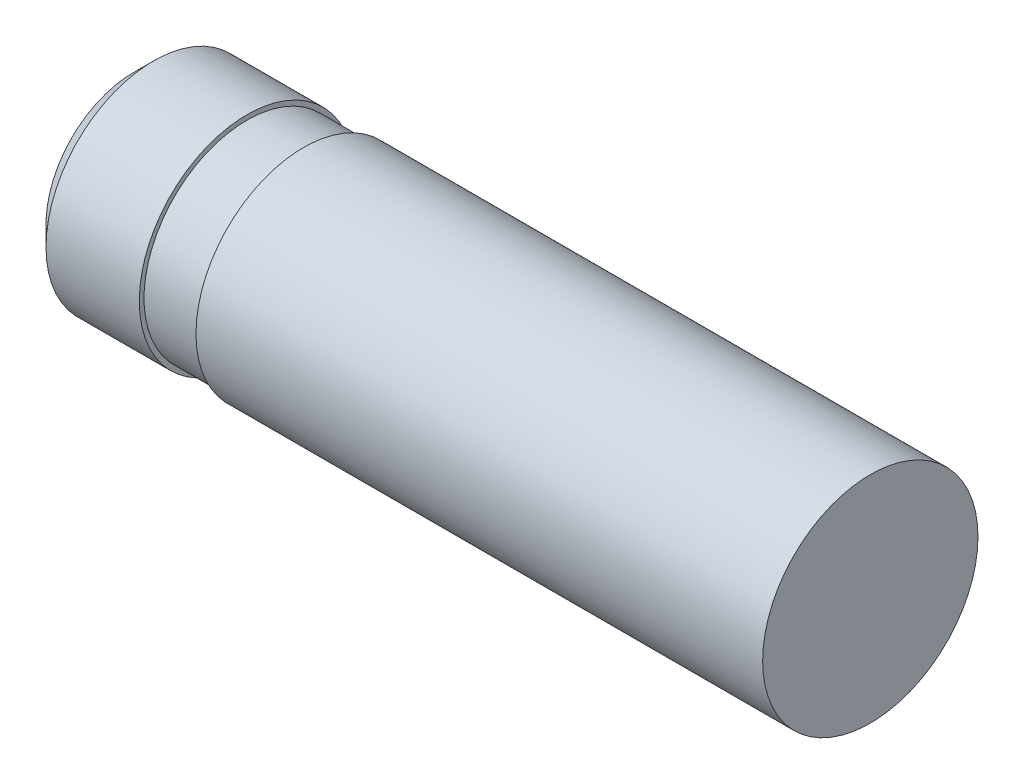
ISO-10303-21;
HEADER;
FILE_DESCRIPTION(('STEP AP214'),'2;1');
FILE_NAME('part.step','',(''),(''),'','','');
FILE_SCHEMA(('AUTOMOTIVE_DESIGN { 1 0 10303 214 1 1 1 1 }'));
ENDSEC;
DATA;
#1=APPLICATION_CONTEXT('core data for automotive mechanical design processes');
#2=APPLICATION_PROTOCOL_DEFINITION('international standard','automotive_design',2000,#1);
#3=PRODUCT_CONTEXT('',#1,'mechanical');
#4=PRODUCT('Part','Part','',(#3));
#5=PRODUCT_RELATED_PRODUCT_CATEGORY('part','',(#4));
#6=PRODUCT_DEFINITION_FORMATION('','',#4);
#7=PRODUCT_DEFINITION_CONTEXT('part definition',#1,'design');
#8=PRODUCT_DEFINITION('design','',#6,#7);
#9=PRODUCT_DEFINITION_SHAPE('','',#8);
#10=(LENGTH_UNIT() NAMED_UNIT(*) SI_UNIT(.MILLI.,.METRE.));
#11=(NAMED_UNIT(*) PLANE_ANGLE_UNIT() SI_UNIT($,.RADIAN.));
#12=(NAMED_UNIT(*) SI_UNIT($,.STERADIAN.) SOLID_ANGLE_UNIT());
#13=UNCERTAINTY_MEASURE_WITH_UNIT(LENGTH_MEASURE(1.E-05),#10,'distance_accuracy_value','');
#14=(GEOMETRIC_REPRESENTATION_CONTEXT(3) GLOBAL_UNCERTAINTY_ASSIGNED_CONTEXT((#13)) GLOBAL_UNIT_ASSIGNED_CONTEXT((#10,
#11,#12)) REPRESENTATION_CONTEXT('',''));
#15=CARTESIAN_POINT('',(0.,0.,0.));
#16=DIRECTION('',(0.,0.,1.));
#17=DIRECTION('',(1.,0.,0.));
#18=AXIS2_PLACEMENT_3D('',#15,#16,#17);
#19=CARTESIAN_POINT('',(0.,0.,0.));
#20=DIRECTION('',(-1.,0.,0.));
#21=DIRECTION('',(0.,0.,1.));
#22=AXIS2_PLACEMENT_3D('',#19,#20,#21);
#23=PLANE('',#22);
#24=CARTESIAN_POINT('',(0.,0.,0.));
#25=DIRECTION('',(1.,0.,0.));
#26=DIRECTION('',(0.,0.,-1.));
#27=AXIS2_PLACEMENT_3D('',#24,#25,#26);
#28=CIRCLE('',#27,1.54644660940673);
#29=CARTESIAN_POINT('',(0.,0.,-1.54644660940673));
#30=VERTEX_POINT('',#29);
#31=EDGE_CURVE('E10',#30,#30,#28,.T.);
#32=ORIENTED_EDGE('',*,*,#31,.F.);
#33=EDGE_LOOP('',(#32));
#34=FACE_BOUND('',#33,.T.);
#35=ADVANCED_FACE('F41',(#34),#23,.T.);
#36=CARTESIAN_POINT('',(0.353553390593273,0.,0.));
#37=DIRECTION('',(1.,0.,0.));
#38=DIRECTION('',(0.,0.,-1.));
#39=AXIS2_PLACEMENT_3D('',#36,#37,#38);
#40=CONICAL_SURFACE('',#39,1.9,0.785398163397451);
#41=ORIENTED_EDGE('',*,*,#31,.T.);
#42=EDGE_LOOP('',(#41));
#43=FACE_BOUND('',#42,.T.);
#44=CARTESIAN_POINT('',(0.353553390593273,0.,0.));
#45=DIRECTION('',(1.,0.,0.));
#46=DIRECTION('',(0.,0.,-1.));
#47=AXIS2_PLACEMENT_3D('',#44,#45,#46);
#48=CIRCLE('',#47,1.9);
#49=CARTESIAN_POINT('',(0.353553390593273,0.,-1.9));
#50=VERTEX_POINT('',#49);
#51=EDGE_CURVE('E48',#50,#50,#48,.T.);
#52=ORIENTED_EDGE('',*,*,#51,.F.);
#53=EDGE_LOOP('',(#52));
#54=FACE_BOUND('',#53,.T.);
#55=ADVANCED_FACE('F93',(#43,#54),#40,.T.);
#56=CARTESIAN_POINT('',(13.,0.,0.));
#57=DIRECTION('',(1.,0.,0.));
#58=DIRECTION('',(0.,0.,-1.));
#59=AXIS2_PLACEMENT_3D('',#56,#57,#58);
#60=CYLINDRICAL_SURFACE('',#59,1.9);
#61=ORIENTED_EDGE('',*,*,#51,.T.);
#62=EDGE_LOOP('',(#61));
#63=FACE_BOUND('',#62,.T.);
#64=CARTESIAN_POINT('',(2.,0.,0.));
#65=DIRECTION('',(1.,0.,0.));
#66=DIRECTION('',(0.,0.,-1.));
#67=AXIS2_PLACEMENT_3D('',#64,#65,#66);
#68=CIRCLE('',#67,1.9);
#69=CARTESIAN_POINT('',(2.,0.,-1.9));
#70=VERTEX_POINT('',#69);
#71=EDGE_CURVE('E53',#70,#70,#68,.T.);
#72=ORIENTED_EDGE('',*,*,#71,.F.);
#73=EDGE_LOOP('',(#72));
#74=FACE_BOUND('',#73,.T.);
#75=ADVANCED_FACE('F98',(#63,#74),#60,.T.);
#76=CARTESIAN_POINT('',(2.,1.9,0.));
#77=DIRECTION('',(1.,0.,0.));
#78=DIRECTION('',(0.,0.,-1.));
#79=AXIS2_PLACEMENT_3D('',#76,#77,#78);
#80=PLANE('',#79);
#81=ORIENTED_EDGE('',*,*,#71,.T.);
#82=EDGE_LOOP('',(#81));
#83=FACE_BOUND('',#82,.T.);
#84=CARTESIAN_POINT('',(2.,0.,0.));
#85=DIRECTION('',(1.,0.,0.));
#86=DIRECTION('',(0.,0.,-1.));
#87=AXIS2_PLACEMENT_3D('',#84,#85,#86);
#88=CIRCLE('',#87,1.81662175541077);
#89=CARTESIAN_POINT('',(2.,0.,-1.81662175541077));
#90=VERTEX_POINT('',#89);
#91=EDGE_CURVE('E58',#90,#90,#88,.T.);
#92=ORIENTED_EDGE('',*,*,#91,.F.);
#93=EDGE_LOOP('',(#92));
#94=FACE_BOUND('',#93,.T.);
#95=ADVANCED_FACE('F102',(#83,#94),#80,.T.);
#96=CARTESIAN_POINT('',(13.,0.,0.));
#97=DIRECTION('',(1.,0.,0.));
#98=DIRECTION('',(0.,0.,-1.));
#99=AXIS2_PLACEMENT_3D('',#96,#97,#98);
#100=CYLINDRICAL_SURFACE('',#99,1.81662175541077);
#101=ORIENTED_EDGE('',*,*,#91,.T.);
#102=EDGE_LOOP('',(#101));
#103=FACE_BOUND('',#102,.T.);
#104=CARTESIAN_POINT('',(3.,0.,0.));
#105=DIRECTION('',(1.,0.,0.));
#106=DIRECTION('',(0.,0.,-1.));
#107=AXIS2_PLACEMENT_3D('',#104,#105,#106);
#108=CIRCLE('',#107,1.81662175541077);
#109=CARTESIAN_POINT('',(3.,0.,-1.81662175541077));
#110=VERTEX_POINT('',#109);
#111=EDGE_CURVE('E64',#110,#110,#108,.T.);
#112=ORIENTED_EDGE('',*,*,#111,.F.);
#113=EDGE_LOOP('',(#112));
#114=FACE_BOUND('',#113,.T.);
#115=ADVANCED_FACE('F89',(#103,#114),#100,.T.);
#116=CARTESIAN_POINT('',(3.,1.81662175541077,0.));
#117=DIRECTION('',(-1.,0.,0.));
#118=DIRECTION('',(0.,0.,1.));
#119=AXIS2_PLACEMENT_3D('',#116,#117,#118);
#120=PLANE('',#119);
#121=ORIENTED_EDGE('',*,*,#111,.T.);
#122=EDGE_LOOP('',(#121));
#123=FACE_BOUND('',#122,.T.);
#124=CARTESIAN_POINT('',(3.,0.,0.));
#125=DIRECTION('',(1.,0.,0.));
#126=DIRECTION('',(0.,0.,-1.));
#127=AXIS2_PLACEMENT_3D('',#124,#125,#126);
#128=CIRCLE('',#127,1.9);
#129=CARTESIAN_POINT('',(3.,0.,-1.9));
#130=VERTEX_POINT('',#129);
#131=EDGE_CURVE('E68',#130,#130,#128,.T.);
#132=ORIENTED_EDGE('',*,*,#131,.F.);
#133=EDGE_LOOP('',(#132));
#134=FACE_BOUND('',#133,.T.);
#135=ADVANCED_FACE('F81',(#123,#134),#120,.T.);
#136=CARTESIAN_POINT('',(13.,0.,0.));
#137=DIRECTION('',(1.,0.,0.));
#138=DIRECTION('',(0.,0.,-1.));
#139=AXIS2_PLACEMENT_3D('',#136,#137,#138);
#140=CYLINDRICAL_SURFACE('',#139,1.9);
#141=ORIENTED_EDGE('',*,*,#131,.T.);
#142=EDGE_LOOP('',(#141));
#143=FACE_BOUND('',#142,.T.);
#144=CARTESIAN_POINT('',(13.,0.,0.));
#145=DIRECTION('',(1.,0.,0.));
#146=DIRECTION('',(0.,0.,-1.));
#147=AXIS2_PLACEMENT_3D('',#144,#145,#146);
#148=CIRCLE('',#147,1.9);
#149=CARTESIAN_POINT('',(13.,0.,-1.9));
#150=VERTEX_POINT('',#149);
#151=EDGE_CURVE('E72',#150,#150,#148,.T.);
#152=ORIENTED_EDGE('',*,*,#151,.F.);
#153=EDGE_LOOP('',(#152));
#154=FACE_BOUND('',#153,.T.);
#155=ADVANCED_FACE('F79',(#143,#154),#140,.T.);
#156=CARTESIAN_POINT('',(13.,1.9,0.));
#157=DIRECTION('',(1.,0.,0.));
#158=DIRECTION('',(0.,0.,-1.));
#159=AXIS2_PLACEMENT_3D('',#156,#157,#158);
#160=PLANE('',#159);
#161=ORIENTED_EDGE('',*,*,#151,.T.);
#162=EDGE_LOOP('',(#161));
#163=FACE_BOUND('',#162,.T.);
#164=ADVANCED_FACE('F77',(#163),#160,.T.);
#165=CLOSED_SHELL('',(#35,#55,#75,#95,#115,#135,#155,#164));
#166=MANIFOLD_SOLID_BREP('B2',#165);
#167=ADVANCED_BREP_SHAPE_REPRESENTATION('',(#18,#166),#14);
#168=SHAPE_DEFINITION_REPRESENTATION(#9,#167);
ENDSEC;
END-ISO-10303-21;
